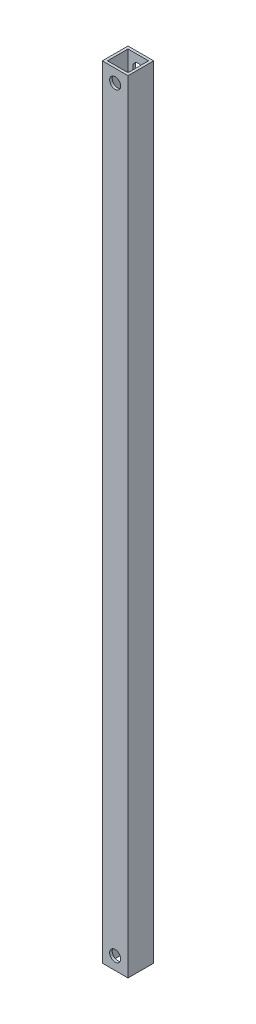
ISO-10303-21;
HEADER;
FILE_DESCRIPTION(('STEP AP214'),'2;1');
FILE_NAME('part.step','',(''),(''),'','','');
FILE_SCHEMA(('AUTOMOTIVE_DESIGN { 1 0 10303 214 1 1 1 1 }'));
ENDSEC;
DATA;
#1=APPLICATION_CONTEXT('core data for automotive mechanical design processes');
#2=APPLICATION_PROTOCOL_DEFINITION('international standard','automotive_design',2000,#1);
#3=PRODUCT_CONTEXT('',#1,'mechanical');
#4=PRODUCT('Part','Part','',(#3));
#5=PRODUCT_RELATED_PRODUCT_CATEGORY('part','',(#4));
#6=PRODUCT_DEFINITION_FORMATION('','',#4);
#7=PRODUCT_DEFINITION_CONTEXT('part definition',#1,'design');
#8=PRODUCT_DEFINITION('design','',#6,#7);
#9=PRODUCT_DEFINITION_SHAPE('','',#8);
#10=(LENGTH_UNIT() NAMED_UNIT(*) SI_UNIT(.MILLI.,.METRE.));
#11=(NAMED_UNIT(*) PLANE_ANGLE_UNIT() SI_UNIT($,.RADIAN.));
#12=(NAMED_UNIT(*) SI_UNIT($,.STERADIAN.) SOLID_ANGLE_UNIT());
#13=UNCERTAINTY_MEASURE_WITH_UNIT(LENGTH_MEASURE(1.E-05),#10,'distance_accuracy_value','');
#14=(GEOMETRIC_REPRESENTATION_CONTEXT(3) GLOBAL_UNCERTAINTY_ASSIGNED_CONTEXT((#13)) GLOBAL_UNIT_ASSIGNED_CONTEXT((#10,
#11,#12)) REPRESENTATION_CONTEXT('',''));
#15=CARTESIAN_POINT('',(0.,0.,0.));
#16=DIRECTION('',(0.,0.,1.));
#17=DIRECTION('',(1.,0.,0.));
#18=AXIS2_PLACEMENT_3D('',#15,#16,#17);
#19=CARTESIAN_POINT('',(0.,304.359049461708,0.));
#20=DIRECTION('',(0.,1.,0.));
#21=DIRECTION('',(0.,0.,1.));
#22=AXIS2_PLACEMENT_3D('',#19,#20,#21);
#23=PLANE('',#22);
#24=DIRECTION('',(0.,0.,-1.));
#25=VECTOR('',#24,1.);
#26=CARTESIAN_POINT('',(5.,304.359049461708,-5.));
#27=LINE('',#26,#25);
#28=CARTESIAN_POINT('',(5.,304.359049461708,5.));
#29=VERTEX_POINT('',#28);
#30=CARTESIAN_POINT('',(5.,304.359049461708,-5.));
#31=VERTEX_POINT('',#30);
#32=EDGE_CURVE('E164',#29,#31,#27,.T.);
#33=ORIENTED_EDGE('',*,*,#32,.T.);
#34=DIRECTION('',(-1.,0.,0.));
#35=VECTOR('',#34,1.);
#36=CARTESIAN_POINT('',(-5.,304.359049461708,-5.));
#37=LINE('',#36,#35);
#38=CARTESIAN_POINT('',(-5.,304.359049461708,-5.));
#39=VERTEX_POINT('',#38);
#40=EDGE_CURVE('E167',#31,#39,#37,.T.);
#41=ORIENTED_EDGE('',*,*,#40,.T.);
#42=DIRECTION('',(0.,0.,1.));
#43=VECTOR('',#42,1.);
#44=CARTESIAN_POINT('',(-5.,304.359049461708,-5.));
#45=LINE('',#44,#43);
#46=CARTESIAN_POINT('',(-5.,304.359049461708,5.));
#47=VERTEX_POINT('',#46);
#48=EDGE_CURVE('E170',#39,#47,#45,.T.);
#49=ORIENTED_EDGE('',*,*,#48,.T.);
#50=DIRECTION('',(1.,0.,0.));
#51=VECTOR('',#50,1.);
#52=CARTESIAN_POINT('',(-5.,304.359049461708,5.));
#53=LINE('',#52,#51);
#54=EDGE_CURVE('E172',#47,#29,#53,.T.);
#55=ORIENTED_EDGE('',*,*,#54,.T.);
#56=EDGE_LOOP('',(#33,#41,#49,#55));
#57=FACE_BOUND('',#56,.T.);
#58=DIRECTION('',(-1.,0.,0.));
#59=VECTOR('',#58,1.);
#60=CARTESIAN_POINT('',(-5.,304.359049461708,-4.));
#61=LINE('',#60,#59);
#62=CARTESIAN_POINT('',(4.,304.359049461708,-4.));
#63=VERTEX_POINT('',#62);
#64=CARTESIAN_POINT('',(-4.,304.359049461708,-4.));
#65=VERTEX_POINT('',#64);
#66=EDGE_CURVE('E134',#63,#65,#61,.T.);
#67=ORIENTED_EDGE('',*,*,#66,.F.);
#68=DIRECTION('',(0.,0.,-1.));
#69=VECTOR('',#68,1.);
#70=CARTESIAN_POINT('',(4.,304.359049461708,-5.));
#71=LINE('',#70,#69);
#72=CARTESIAN_POINT('',(4.,304.359049461708,4.));
#73=VERTEX_POINT('',#72);
#74=EDGE_CURVE('E126',#73,#63,#71,.T.);
#75=ORIENTED_EDGE('',*,*,#74,.F.);
#76=DIRECTION('',(1.,0.,0.));
#77=VECTOR('',#76,1.);
#78=CARTESIAN_POINT('',(-5.,304.359049461708,4.));
#79=LINE('',#78,#77);
#80=CARTESIAN_POINT('',(-4.,304.359049461708,4.));
#81=VERTEX_POINT('',#80);
#82=EDGE_CURVE('E148',#81,#73,#79,.T.);
#83=ORIENTED_EDGE('',*,*,#82,.F.);
#84=DIRECTION('',(0.,0.,1.));
#85=VECTOR('',#84,1.);
#86=CARTESIAN_POINT('',(-4.,304.359049461708,-5.));
#87=LINE('',#86,#85);
#88=EDGE_CURVE('E146',#65,#81,#87,.T.);
#89=ORIENTED_EDGE('',*,*,#88,.F.);
#90=EDGE_LOOP('',(#67,#75,#83,#89));
#91=FACE_BOUND('',#90,.T.);
#92=ADVANCED_FACE('F59',(#57,#91),#23,.T.);
#93=CARTESIAN_POINT('',(0.,0.,0.));
#94=DIRECTION('',(0.,1.,0.));
#95=DIRECTION('',(0.,0.,1.));
#96=AXIS2_PLACEMENT_3D('',#93,#94,#95);
#97=PLANE('',#96);
#98=DIRECTION('',(0.,0.,-1.));
#99=VECTOR('',#98,1.);
#100=CARTESIAN_POINT('',(5.,0.,-5.));
#101=LINE('',#100,#99);
#102=CARTESIAN_POINT('',(5.,0.,5.));
#103=VERTEX_POINT('',#102);
#104=CARTESIAN_POINT('',(5.,0.,-5.));
#105=VERTEX_POINT('',#104);
#106=EDGE_CURVE('E142',#103,#105,#101,.T.);
#107=ORIENTED_EDGE('',*,*,#106,.F.);
#108=DIRECTION('',(1.,0.,0.));
#109=VECTOR('',#108,1.);
#110=CARTESIAN_POINT('',(-5.,0.,5.));
#111=LINE('',#110,#109);
#112=CARTESIAN_POINT('',(-5.,0.,5.));
#113=VERTEX_POINT('',#112);
#114=EDGE_CURVE('E168',#113,#103,#111,.T.);
#115=ORIENTED_EDGE('',*,*,#114,.F.);
#116=DIRECTION('',(0.,0.,1.));
#117=VECTOR('',#116,1.);
#118=CARTESIAN_POINT('',(-5.,0.,-5.));
#119=LINE('',#118,#117);
#120=CARTESIAN_POINT('',(-5.,0.,-5.));
#121=VERTEX_POINT('',#120);
#122=EDGE_CURVE('E179',#121,#113,#119,.T.);
#123=ORIENTED_EDGE('',*,*,#122,.F.);
#124=DIRECTION('',(-1.,0.,0.));
#125=VECTOR('',#124,1.);
#126=CARTESIAN_POINT('',(-5.,0.,-5.));
#127=LINE('',#126,#125);
#128=EDGE_CURVE('E177',#105,#121,#127,.T.);
#129=ORIENTED_EDGE('',*,*,#128,.F.);
#130=EDGE_LOOP('',(#107,#115,#123,#129));
#131=FACE_BOUND('',#130,.T.);
#132=DIRECTION('',(0.,0.,-1.));
#133=VECTOR('',#132,1.);
#134=CARTESIAN_POINT('',(4.,0.,-5.));
#135=LINE('',#134,#133);
#136=CARTESIAN_POINT('',(4.,0.,4.));
#137=VERTEX_POINT('',#136);
#138=CARTESIAN_POINT('',(4.,0.,-4.));
#139=VERTEX_POINT('',#138);
#140=EDGE_CURVE('E84',#137,#139,#135,.T.);
#141=ORIENTED_EDGE('',*,*,#140,.T.);
#142=DIRECTION('',(-1.,0.,0.));
#143=VECTOR('',#142,1.);
#144=CARTESIAN_POINT('',(-5.,0.,-4.));
#145=LINE('',#144,#143);
#146=CARTESIAN_POINT('',(-4.,0.,-4.));
#147=VERTEX_POINT('',#146);
#148=EDGE_CURVE('E141',#139,#147,#145,.T.);
#149=ORIENTED_EDGE('',*,*,#148,.T.);
#150=DIRECTION('',(0.,0.,1.));
#151=VECTOR('',#150,1.);
#152=CARTESIAN_POINT('',(-4.,0.,-5.));
#153=LINE('',#152,#151);
#154=CARTESIAN_POINT('',(-4.,0.,4.));
#155=VERTEX_POINT('',#154);
#156=EDGE_CURVE('E156',#147,#155,#153,.T.);
#157=ORIENTED_EDGE('',*,*,#156,.T.);
#158=DIRECTION('',(1.,0.,0.));
#159=VECTOR('',#158,1.);
#160=CARTESIAN_POINT('',(-5.,0.,4.));
#161=LINE('',#160,#159);
#162=EDGE_CURVE('E135',#155,#137,#161,.T.);
#163=ORIENTED_EDGE('',*,*,#162,.T.);
#164=EDGE_LOOP('',(#141,#149,#157,#163));
#165=FACE_BOUND('',#164,.T.);
#166=ADVANCED_FACE('F226',(#131,#165),#97,.F.);
#167=CARTESIAN_POINT('',(5.,304.359049461708,-5.));
#168=DIRECTION('',(-1.,0.,0.));
#169=DIRECTION('',(0.,0.,1.));
#170=AXIS2_PLACEMENT_3D('',#167,#168,#169);
#171=PLANE('',#170);
#172=ORIENTED_EDGE('',*,*,#106,.T.);
#173=DIRECTION('',(0.,-1.,0.));
#174=VECTOR('',#173,1.);
#175=CARTESIAN_POINT('',(5.,304.359049461708,-5.));
#176=LINE('',#175,#174);
#177=EDGE_CURVE('E12',#31,#105,#176,.T.);
#178=ORIENTED_EDGE('',*,*,#177,.F.);
#179=ORIENTED_EDGE('',*,*,#32,.F.);
#180=DIRECTION('',(0.,-1.,0.));
#181=VECTOR('',#180,1.);
#182=CARTESIAN_POINT('',(5.,304.359049461708,5.));
#183=LINE('',#182,#181);
#184=EDGE_CURVE('E174',#29,#103,#183,.T.);
#185=ORIENTED_EDGE('',*,*,#184,.T.);
#186=EDGE_LOOP('',(#172,#178,#179,#185));
#187=FACE_BOUND('',#186,.T.);
#188=ADVANCED_FACE('F61',(#187),#171,.F.);
#189=CARTESIAN_POINT('',(-5.,304.359049461708,-5.));
#190=DIRECTION('',(0.,0.,1.));
#191=DIRECTION('',(1.,0.,0.));
#192=AXIS2_PLACEMENT_3D('',#189,#190,#191);
#193=PLANE('',#192);
#194=CARTESIAN_POINT('',(0.,299.359049461708,-5.));
#195=DIRECTION('',(0.,0.,1.));
#196=DIRECTION('',(1.,0.,0.));
#197=AXIS2_PLACEMENT_3D('',#194,#195,#196);
#198=CIRCLE('',#197,2.15000000000001);
#199=CARTESIAN_POINT('',(2.15000000000003,299.359049461708,-5.));
#200=VERTEX_POINT('',#199);
#201=EDGE_CURVE('E191',#200,#200,#198,.T.);
#202=ORIENTED_EDGE('',*,*,#201,.T.);
#203=EDGE_LOOP('',(#202));
#204=FACE_BOUND('',#203,.T.);
#205=CARTESIAN_POINT('',(0.,5.00000000000012,-5.));
#206=DIRECTION('',(0.,0.,1.));
#207=DIRECTION('',(-1.,0.,0.));
#208=AXIS2_PLACEMENT_3D('',#205,#206,#207);
#209=CIRCLE('',#208,2.15000000000001);
#210=CARTESIAN_POINT('',(-2.15000000000001,5.00000000000012,-5.));
#211=VERTEX_POINT('',#210);
#212=EDGE_CURVE('E202',#211,#211,#209,.T.);
#213=ORIENTED_EDGE('',*,*,#212,.T.);
#214=EDGE_LOOP('',(#213));
#215=FACE_BOUND('',#214,.T.);
#216=ORIENTED_EDGE('',*,*,#128,.T.);
#217=DIRECTION('',(0.,-1.,0.));
#218=VECTOR('',#217,1.);
#219=CARTESIAN_POINT('',(-5.,304.359049461708,-5.));
#220=LINE('',#219,#218);
#221=EDGE_CURVE('E68',#39,#121,#220,.T.);
#222=ORIENTED_EDGE('',*,*,#221,.F.);
#223=ORIENTED_EDGE('',*,*,#40,.F.);
#224=ORIENTED_EDGE('',*,*,#177,.T.);
#225=EDGE_LOOP('',(#216,#222,#223,#224));
#226=FACE_BOUND('',#225,.T.);
#227=ADVANCED_FACE('F251',(#204,#215,#226),#193,.F.);
#228=CARTESIAN_POINT('',(-5.,304.359049461708,-5.));
#229=DIRECTION('',(1.,0.,0.));
#230=DIRECTION('',(0.,0.,-1.));
#231=AXIS2_PLACEMENT_3D('',#228,#229,#230);
#232=PLANE('',#231);
#233=ORIENTED_EDGE('',*,*,#122,.T.);
#234=DIRECTION('',(0.,-1.,0.));
#235=VECTOR('',#234,1.);
#236=CARTESIAN_POINT('',(-5.,304.359049461708,5.));
#237=LINE('',#236,#235);
#238=EDGE_CURVE('E184',#47,#113,#237,.T.);
#239=ORIENTED_EDGE('',*,*,#238,.F.);
#240=ORIENTED_EDGE('',*,*,#48,.F.);
#241=ORIENTED_EDGE('',*,*,#221,.T.);
#242=EDGE_LOOP('',(#233,#239,#240,#241));
#243=FACE_BOUND('',#242,.T.);
#244=ADVANCED_FACE('F248',(#243),#232,.F.);
#245=CARTESIAN_POINT('',(-5.,304.359049461708,5.));
#246=DIRECTION('',(0.,0.,-1.));
#247=DIRECTION('',(-1.,0.,0.));
#248=AXIS2_PLACEMENT_3D('',#245,#246,#247);
#249=PLANE('',#248);
#250=CARTESIAN_POINT('',(0.,299.359049461708,5.));
#251=DIRECTION('',(0.,0.,1.));
#252=DIRECTION('',(1.,0.,0.));
#253=AXIS2_PLACEMENT_3D('',#250,#251,#252);
#254=CIRCLE('',#253,2.15000000000001);
#255=CARTESIAN_POINT('',(2.15000000000003,299.359049461708,5.));
#256=VERTEX_POINT('',#255);
#257=EDGE_CURVE('E197',#256,#256,#254,.T.);
#258=ORIENTED_EDGE('',*,*,#257,.F.);
#259=EDGE_LOOP('',(#258));
#260=FACE_BOUND('',#259,.T.);
#261=CARTESIAN_POINT('',(0.,5.00000000000012,5.));
#262=DIRECTION('',(0.,0.,1.));
#263=DIRECTION('',(-1.,0.,0.));
#264=AXIS2_PLACEMENT_3D('',#261,#262,#263);
#265=CIRCLE('',#264,2.15000000000001);
#266=CARTESIAN_POINT('',(-2.15000000000001,5.00000000000012,5.));
#267=VERTEX_POINT('',#266);
#268=EDGE_CURVE('E207',#267,#267,#265,.T.);
#269=ORIENTED_EDGE('',*,*,#268,.F.);
#270=EDGE_LOOP('',(#269));
#271=FACE_BOUND('',#270,.T.);
#272=ORIENTED_EDGE('',*,*,#114,.T.);
#273=ORIENTED_EDGE('',*,*,#184,.F.);
#274=ORIENTED_EDGE('',*,*,#54,.F.);
#275=ORIENTED_EDGE('',*,*,#238,.T.);
#276=EDGE_LOOP('',(#272,#273,#274,#275));
#277=FACE_BOUND('',#276,.T.);
#278=ADVANCED_FACE('F245',(#260,#271,#277),#249,.F.);
#279=CARTESIAN_POINT('',(4.,304.359049461708,-5.));
#280=DIRECTION('',(-1.,0.,0.));
#281=DIRECTION('',(0.,0.,1.));
#282=AXIS2_PLACEMENT_3D('',#279,#280,#281);
#283=PLANE('',#282);
#284=ORIENTED_EDGE('',*,*,#140,.F.);
#285=DIRECTION('',(0.,-1.,0.));
#286=VECTOR('',#285,1.);
#287=CARTESIAN_POINT('',(4.,304.359049461708,4.));
#288=LINE('',#287,#286);
#289=EDGE_CURVE('E130',#73,#137,#288,.T.);
#290=ORIENTED_EDGE('',*,*,#289,.F.);
#291=ORIENTED_EDGE('',*,*,#74,.T.);
#292=DIRECTION('',(0.,-1.,0.));
#293=VECTOR('',#292,1.);
#294=CARTESIAN_POINT('',(4.,304.359049461708,-4.));
#295=LINE('',#294,#293);
#296=EDGE_CURVE('E129',#63,#139,#295,.T.);
#297=ORIENTED_EDGE('',*,*,#296,.T.);
#298=EDGE_LOOP('',(#284,#290,#291,#297));
#299=FACE_BOUND('',#298,.T.);
#300=ADVANCED_FACE('F128',(#299),#283,.T.);
#301=CARTESIAN_POINT('',(-5.,304.359049461708,-4.));
#302=DIRECTION('',(0.,0.,1.));
#303=DIRECTION('',(1.,0.,0.));
#304=AXIS2_PLACEMENT_3D('',#301,#302,#303);
#305=PLANE('',#304);
#306=CARTESIAN_POINT('',(0.,299.359049461708,-4.));
#307=DIRECTION('',(0.,0.,1.));
#308=DIRECTION('',(1.,0.,0.));
#309=AXIS2_PLACEMENT_3D('',#306,#307,#308);
#310=CIRCLE('',#309,2.15000000000001);
#311=CARTESIAN_POINT('',(2.15000000000003,299.359049461708,-4.));
#312=VERTEX_POINT('',#311);
#313=EDGE_CURVE('E154',#312,#312,#310,.T.);
#314=ORIENTED_EDGE('',*,*,#313,.F.);
#315=EDGE_LOOP('',(#314));
#316=FACE_BOUND('',#315,.T.);
#317=CARTESIAN_POINT('',(0.,5.00000000000012,-4.));
#318=DIRECTION('',(0.,0.,1.));
#319=DIRECTION('',(1.,0.,0.));
#320=AXIS2_PLACEMENT_3D('',#317,#318,#319);
#321=CIRCLE('',#320,2.15000000000001);
#322=CARTESIAN_POINT('',(2.15000000000001,5.00000000000012,-4.));
#323=VERTEX_POINT('',#322);
#324=EDGE_CURVE('E190',#323,#323,#321,.T.);
#325=ORIENTED_EDGE('',*,*,#324,.F.);
#326=EDGE_LOOP('',(#325));
#327=FACE_BOUND('',#326,.T.);
#328=ORIENTED_EDGE('',*,*,#148,.F.);
#329=ORIENTED_EDGE('',*,*,#296,.F.);
#330=ORIENTED_EDGE('',*,*,#66,.T.);
#331=DIRECTION('',(0.,-1.,0.));
#332=VECTOR('',#331,1.);
#333=CARTESIAN_POINT('',(-4.,304.359049461708,-4.));
#334=LINE('',#333,#332);
#335=EDGE_CURVE('E143',#65,#147,#334,.T.);
#336=ORIENTED_EDGE('',*,*,#335,.T.);
#337=EDGE_LOOP('',(#328,#329,#330,#336));
#338=FACE_BOUND('',#337,.T.);
#339=ADVANCED_FACE('F138',(#316,#327,#338),#305,.T.);
#340=CARTESIAN_POINT('',(-4.,304.359049461708,-5.));
#341=DIRECTION('',(1.,0.,0.));
#342=DIRECTION('',(0.,0.,-1.));
#343=AXIS2_PLACEMENT_3D('',#340,#341,#342);
#344=PLANE('',#343);
#345=ORIENTED_EDGE('',*,*,#156,.F.);
#346=ORIENTED_EDGE('',*,*,#335,.F.);
#347=ORIENTED_EDGE('',*,*,#88,.T.);
#348=DIRECTION('',(0.,-1.,0.));
#349=VECTOR('',#348,1.);
#350=CARTESIAN_POINT('',(-4.,304.359049461708,4.));
#351=LINE('',#350,#349);
#352=EDGE_CURVE('E76',#81,#155,#351,.T.);
#353=ORIENTED_EDGE('',*,*,#352,.T.);
#354=EDGE_LOOP('',(#345,#346,#347,#353));
#355=FACE_BOUND('',#354,.T.);
#356=ADVANCED_FACE('F222',(#355),#344,.T.);
#357=CARTESIAN_POINT('',(-5.,304.359049461708,4.));
#358=DIRECTION('',(0.,0.,-1.));
#359=DIRECTION('',(-1.,0.,0.));
#360=AXIS2_PLACEMENT_3D('',#357,#358,#359);
#361=PLANE('',#360);
#362=CARTESIAN_POINT('',(0.,299.359049461708,4.));
#363=DIRECTION('',(0.,0.,-1.));
#364=DIRECTION('',(-1.,0.,0.));
#365=AXIS2_PLACEMENT_3D('',#362,#363,#364);
#366=CIRCLE('',#365,2.15000000000001);
#367=CARTESIAN_POINT('',(-2.15,299.359049461708,4.));
#368=VERTEX_POINT('',#367);
#369=EDGE_CURVE('E63',#368,#368,#366,.T.);
#370=ORIENTED_EDGE('',*,*,#369,.F.);
#371=EDGE_LOOP('',(#370));
#372=FACE_BOUND('',#371,.T.);
#373=CARTESIAN_POINT('',(0.,5.00000000000012,4.));
#374=DIRECTION('',(0.,0.,-1.));
#375=DIRECTION('',(-1.,0.,0.));
#376=AXIS2_PLACEMENT_3D('',#373,#374,#375);
#377=CIRCLE('',#376,2.15000000000001);
#378=CARTESIAN_POINT('',(-2.15000000000001,5.00000000000012,4.));
#379=VERTEX_POINT('',#378);
#380=EDGE_CURVE('E188',#379,#379,#377,.T.);
#381=ORIENTED_EDGE('',*,*,#380,.F.);
#382=EDGE_LOOP('',(#381));
#383=FACE_BOUND('',#382,.T.);
#384=ORIENTED_EDGE('',*,*,#162,.F.);
#385=ORIENTED_EDGE('',*,*,#352,.F.);
#386=ORIENTED_EDGE('',*,*,#82,.T.);
#387=ORIENTED_EDGE('',*,*,#289,.T.);
#388=EDGE_LOOP('',(#384,#385,#386,#387));
#389=FACE_BOUND('',#388,.T.);
#390=ADVANCED_FACE('F218',(#372,#383,#389),#361,.T.);
#391=CARTESIAN_POINT('',(0.,5.00000000000012,-5.));
#392=DIRECTION('',(0.,0.,1.));
#393=DIRECTION('',(1.,0.,0.));
#394=AXIS2_PLACEMENT_3D('',#391,#392,#393);
#395=CYLINDRICAL_SURFACE('',#394,2.15000000000001);
#396=ORIENTED_EDGE('',*,*,#380,.T.);
#397=EDGE_LOOP('',(#396));
#398=FACE_BOUND('',#397,.T.);
#399=ORIENTED_EDGE('',*,*,#268,.T.);
#400=EDGE_LOOP('',(#399));
#401=FACE_BOUND('',#400,.T.);
#402=ADVANCED_FACE('F221',(#398,#401),#395,.F.);
#403=CARTESIAN_POINT('',(0.,299.359049461708,-5.));
#404=DIRECTION('',(0.,0.,1.));
#405=DIRECTION('',(1.,0.,0.));
#406=AXIS2_PLACEMENT_3D('',#403,#404,#405);
#407=CYLINDRICAL_SURFACE('',#406,2.15000000000001);
#408=ORIENTED_EDGE('',*,*,#369,.T.);
#409=EDGE_LOOP('',(#408));
#410=FACE_BOUND('',#409,.T.);
#411=ORIENTED_EDGE('',*,*,#257,.T.);
#412=EDGE_LOOP('',(#411));
#413=FACE_BOUND('',#412,.T.);
#414=ADVANCED_FACE('F215',(#410,#413),#407,.F.);
#415=ORIENTED_EDGE('',*,*,#324,.T.);
#416=EDGE_LOOP('',(#415));
#417=FACE_BOUND('',#416,.T.);
#418=ORIENTED_EDGE('',*,*,#212,.F.);
#419=EDGE_LOOP('',(#418));
#420=FACE_BOUND('',#419,.T.);
#421=ADVANCED_FACE('F273',(#417,#420),#395,.F.);
#422=ORIENTED_EDGE('',*,*,#313,.T.);
#423=EDGE_LOOP('',(#422));
#424=FACE_BOUND('',#423,.T.);
#425=ORIENTED_EDGE('',*,*,#201,.F.);
#426=EDGE_LOOP('',(#425));
#427=FACE_BOUND('',#426,.T.);
#428=ADVANCED_FACE('F275',(#424,#427),#407,.F.);
#429=CLOSED_SHELL('',(#92,#166,#188,#227,#244,#278,#300,#339,#356,#390,#402,#414,#421,#428));
#430=MANIFOLD_SOLID_BREP('B2',#429);
#431=ADVANCED_BREP_SHAPE_REPRESENTATION('',(#18,#430),#14);
#432=SHAPE_DEFINITION_REPRESENTATION(#9,#431);
ENDSEC;
END-ISO-10303-21;
